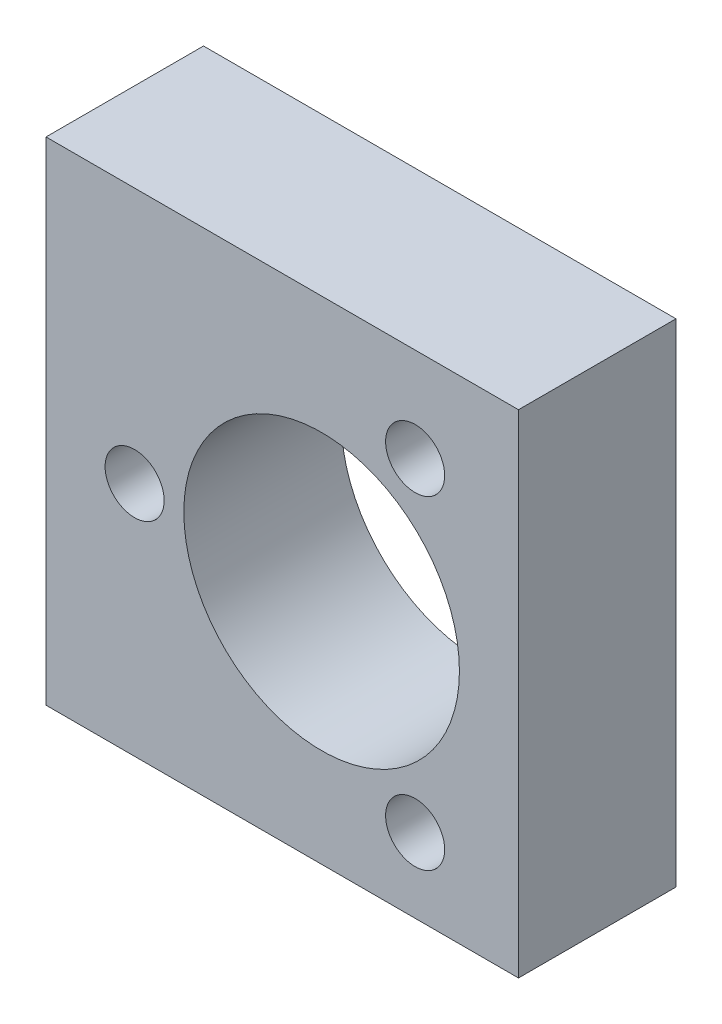
ISO-10303-21;
HEADER;
FILE_DESCRIPTION(('STEP AP214'),'2;1');
FILE_NAME('part.step','',(''),(''),'','','');
FILE_SCHEMA(('AUTOMOTIVE_DESIGN { 1 0 10303 214 1 1 1 1 }'));
ENDSEC;
DATA;
#1=APPLICATION_CONTEXT('core data for automotive mechanical design processes');
#2=APPLICATION_PROTOCOL_DEFINITION('international standard','automotive_design',2000,#1);
#3=PRODUCT_CONTEXT('',#1,'mechanical');
#4=PRODUCT('Part','Part','',(#3));
#5=PRODUCT_RELATED_PRODUCT_CATEGORY('part','',(#4));
#6=PRODUCT_DEFINITION_FORMATION('','',#4);
#7=PRODUCT_DEFINITION_CONTEXT('part definition',#1,'design');
#8=PRODUCT_DEFINITION('design','',#6,#7);
#9=PRODUCT_DEFINITION_SHAPE('','',#8);
#10=(LENGTH_UNIT() NAMED_UNIT(*) SI_UNIT(.MILLI.,.METRE.));
#11=(NAMED_UNIT(*) PLANE_ANGLE_UNIT() SI_UNIT($,.RADIAN.));
#12=(NAMED_UNIT(*) SI_UNIT($,.STERADIAN.) SOLID_ANGLE_UNIT());
#13=UNCERTAINTY_MEASURE_WITH_UNIT(LENGTH_MEASURE(1.E-05),#10,'distance_accuracy_value','');
#14=(GEOMETRIC_REPRESENTATION_CONTEXT(3) GLOBAL_UNCERTAINTY_ASSIGNED_CONTEXT((#13)) GLOBAL_UNIT_ASSIGNED_CONTEXT((#10,
#11,#12)) REPRESENTATION_CONTEXT('',''));
#15=CARTESIAN_POINT('',(0.,0.,0.));
#16=DIRECTION('',(0.,0.,1.));
#17=DIRECTION('',(1.,0.,0.));
#18=AXIS2_PLACEMENT_3D('',#15,#16,#17);
#19=CARTESIAN_POINT('',(0.,0.,8.));
#20=DIRECTION('',(0.,0.,-1.));
#21=DIRECTION('',(-1.,0.,0.));
#22=AXIS2_PLACEMENT_3D('',#19,#20,#21);
#23=PLANE('',#22);
#24=DIRECTION('',(0.,-1.,0.));
#25=VECTOR('',#24,1.);
#26=CARTESIAN_POINT('',(0.,0.,8.));
#27=LINE('',#26,#25);
#28=CARTESIAN_POINT('',(0.,25.,8.));
#29=VERTEX_POINT('',#28);
#30=CARTESIAN_POINT('',(0.,0.,8.));
#31=VERTEX_POINT('',#30);
#32=EDGE_CURVE('E84',#29,#31,#27,.T.);
#33=ORIENTED_EDGE('',*,*,#32,.T.);
#34=DIRECTION('',(1.,0.,0.));
#35=VECTOR('',#34,1.);
#36=CARTESIAN_POINT('',(0.,0.,8.));
#37=LINE('',#36,#35);
#38=CARTESIAN_POINT('',(24.,0.,8.));
#39=VERTEX_POINT('',#38);
#40=EDGE_CURVE('E79',#31,#39,#37,.T.);
#41=ORIENTED_EDGE('',*,*,#40,.T.);
#42=DIRECTION('',(0.,1.,0.));
#43=VECTOR('',#42,1.);
#44=CARTESIAN_POINT('',(24.,0.,8.));
#45=LINE('',#44,#43);
#46=CARTESIAN_POINT('',(24.,25.,8.));
#47=VERTEX_POINT('',#46);
#48=EDGE_CURVE('E82',#39,#47,#45,.T.);
#49=ORIENTED_EDGE('',*,*,#48,.T.);
#50=DIRECTION('',(-1.,0.,0.));
#51=VECTOR('',#50,1.);
#52=CARTESIAN_POINT('',(0.,25.,8.));
#53=LINE('',#52,#51);
#54=EDGE_CURVE('E49',#47,#29,#53,.T.);
#55=ORIENTED_EDGE('',*,*,#54,.T.);
#56=EDGE_LOOP('',(#33,#41,#49,#55));
#57=FACE_BOUND('',#56,.T.);
#58=CARTESIAN_POINT('',(14.,12.,8.));
#59=DIRECTION('',(0.,0.,1.));
#60=DIRECTION('',(1.,0.,0.));
#61=AXIS2_PLACEMENT_3D('',#58,#59,#60);
#62=CIRCLE('',#61,7.);
#63=CARTESIAN_POINT('',(21.,12.,8.));
#64=VERTEX_POINT('',#63);
#65=EDGE_CURVE('E99',#64,#64,#62,.T.);
#66=ORIENTED_EDGE('',*,*,#65,.F.);
#67=EDGE_LOOP('',(#66));
#68=FACE_BOUND('',#67,.T.);
#69=CARTESIAN_POINT('',(4.5,12.,8.));
#70=DIRECTION('',(0.,0.,1.));
#71=DIRECTION('',(1.,0.,0.));
#72=AXIS2_PLACEMENT_3D('',#69,#70,#71);
#73=CIRCLE('',#72,1.5);
#74=CARTESIAN_POINT('',(6.,12.,8.));
#75=VERTEX_POINT('',#74);
#76=EDGE_CURVE('E114',#75,#75,#73,.T.);
#77=ORIENTED_EDGE('',*,*,#76,.F.);
#78=EDGE_LOOP('',(#77));
#79=FACE_BOUND('',#78,.T.);
#80=CARTESIAN_POINT('',(18.75,20.2272413359521,8.));
#81=DIRECTION('',(0.,0.,1.));
#82=DIRECTION('',(1.,0.,0.));
#83=AXIS2_PLACEMENT_3D('',#80,#81,#82);
#84=CIRCLE('',#83,1.5);
#85=CARTESIAN_POINT('',(20.25,20.2272413359521,8.));
#86=VERTEX_POINT('',#85);
#87=EDGE_CURVE('E120',#86,#86,#84,.T.);
#88=ORIENTED_EDGE('',*,*,#87,.F.);
#89=EDGE_LOOP('',(#88));
#90=FACE_BOUND('',#89,.T.);
#91=CARTESIAN_POINT('',(18.7499999999999,3.77275866404779,8.));
#92=DIRECTION('',(0.,0.,1.));
#93=DIRECTION('',(1.,0.,0.));
#94=AXIS2_PLACEMENT_3D('',#91,#92,#93);
#95=CIRCLE('',#94,1.5);
#96=CARTESIAN_POINT('',(20.2499999999999,3.77275866404779,8.));
#97=VERTEX_POINT('',#96);
#98=EDGE_CURVE('E126',#97,#97,#95,.T.);
#99=ORIENTED_EDGE('',*,*,#98,.F.);
#100=EDGE_LOOP('',(#99));
#101=FACE_BOUND('',#100,.T.);
#102=ADVANCED_FACE('F32',(#57,#68,#79,#90,#101),#23,.F.);
#103=CARTESIAN_POINT('',(0.,0.,0.));
#104=DIRECTION('',(0.,0.,-1.));
#105=DIRECTION('',(-1.,0.,0.));
#106=AXIS2_PLACEMENT_3D('',#103,#104,#105);
#107=PLANE('',#106);
#108=CARTESIAN_POINT('',(18.75,20.2272413359521,0.));
#109=DIRECTION('',(0.,0.,1.));
#110=DIRECTION('',(1.,0.,0.));
#111=AXIS2_PLACEMENT_3D('',#108,#109,#110);
#112=CIRCLE('',#111,1.5);
#113=CARTESIAN_POINT('',(20.25,20.2272413359521,0.));
#114=VERTEX_POINT('',#113);
#115=EDGE_CURVE('E123',#114,#114,#112,.T.);
#116=ORIENTED_EDGE('',*,*,#115,.T.);
#117=EDGE_LOOP('',(#116));
#118=FACE_BOUND('',#117,.T.);
#119=CARTESIAN_POINT('',(14.,12.,0.));
#120=DIRECTION('',(0.,0.,1.));
#121=DIRECTION('',(1.,0.,0.));
#122=AXIS2_PLACEMENT_3D('',#119,#120,#121);
#123=CIRCLE('',#122,7.);
#124=CARTESIAN_POINT('',(21.,12.,0.));
#125=VERTEX_POINT('',#124);
#126=EDGE_CURVE('E111',#125,#125,#123,.T.);
#127=ORIENTED_EDGE('',*,*,#126,.T.);
#128=EDGE_LOOP('',(#127));
#129=FACE_BOUND('',#128,.T.);
#130=DIRECTION('',(0.,-1.,0.));
#131=VECTOR('',#130,1.);
#132=CARTESIAN_POINT('',(0.,0.,0.));
#133=LINE('',#132,#131);
#134=CARTESIAN_POINT('',(0.,25.,0.));
#135=VERTEX_POINT('',#134);
#136=CARTESIAN_POINT('',(0.,0.,0.));
#137=VERTEX_POINT('',#136);
#138=EDGE_CURVE('E96',#135,#137,#133,.T.);
#139=ORIENTED_EDGE('',*,*,#138,.F.);
#140=DIRECTION('',(-1.,0.,0.));
#141=VECTOR('',#140,1.);
#142=CARTESIAN_POINT('',(0.,25.,0.));
#143=LINE('',#142,#141);
#144=CARTESIAN_POINT('',(24.,25.,0.));
#145=VERTEX_POINT('',#144);
#146=EDGE_CURVE('E72',#145,#135,#143,.T.);
#147=ORIENTED_EDGE('',*,*,#146,.F.);
#148=DIRECTION('',(0.,1.,0.));
#149=VECTOR('',#148,1.);
#150=CARTESIAN_POINT('',(24.,0.,0.));
#151=LINE('',#150,#149);
#152=CARTESIAN_POINT('',(24.,0.,0.));
#153=VERTEX_POINT('',#152);
#154=EDGE_CURVE('E66',#153,#145,#151,.T.);
#155=ORIENTED_EDGE('',*,*,#154,.F.);
#156=DIRECTION('',(1.,0.,0.));
#157=VECTOR('',#156,1.);
#158=CARTESIAN_POINT('',(0.,0.,0.));
#159=LINE('',#158,#157);
#160=EDGE_CURVE('E88',#137,#153,#159,.T.);
#161=ORIENTED_EDGE('',*,*,#160,.F.);
#162=EDGE_LOOP('',(#139,#147,#155,#161));
#163=FACE_BOUND('',#162,.T.);
#164=CARTESIAN_POINT('',(4.5,12.,0.));
#165=DIRECTION('',(0.,0.,1.));
#166=DIRECTION('',(1.,0.,0.));
#167=AXIS2_PLACEMENT_3D('',#164,#165,#166);
#168=CIRCLE('',#167,1.5);
#169=CARTESIAN_POINT('',(6.,12.,0.));
#170=VERTEX_POINT('',#169);
#171=EDGE_CURVE('E117',#170,#170,#168,.T.);
#172=ORIENTED_EDGE('',*,*,#171,.T.);
#173=EDGE_LOOP('',(#172));
#174=FACE_BOUND('',#173,.T.);
#175=CARTESIAN_POINT('',(18.7499999999999,3.77275866404779,0.));
#176=DIRECTION('',(0.,0.,1.));
#177=DIRECTION('',(1.,0.,0.));
#178=AXIS2_PLACEMENT_3D('',#175,#176,#177);
#179=CIRCLE('',#178,1.5);
#180=CARTESIAN_POINT('',(20.2499999999999,3.77275866404779,0.));
#181=VERTEX_POINT('',#180);
#182=EDGE_CURVE('E129',#181,#181,#179,.T.);
#183=ORIENTED_EDGE('',*,*,#182,.T.);
#184=EDGE_LOOP('',(#183));
#185=FACE_BOUND('',#184,.T.);
#186=ADVANCED_FACE('F107',(#118,#129,#163,#174,#185),#107,.T.);
#187=CARTESIAN_POINT('',(0.,0.,8.));
#188=DIRECTION('',(1.,0.,0.));
#189=DIRECTION('',(0.,0.,-1.));
#190=AXIS2_PLACEMENT_3D('',#187,#188,#189);
#191=PLANE('',#190);
#192=ORIENTED_EDGE('',*,*,#138,.T.);
#193=DIRECTION('',(0.,0.,-1.));
#194=VECTOR('',#193,1.);
#195=CARTESIAN_POINT('',(0.,0.,8.));
#196=LINE('',#195,#194);
#197=EDGE_CURVE('E11',#31,#137,#196,.T.);
#198=ORIENTED_EDGE('',*,*,#197,.F.);
#199=ORIENTED_EDGE('',*,*,#32,.F.);
#200=DIRECTION('',(0.,0.,-1.));
#201=VECTOR('',#200,1.);
#202=CARTESIAN_POINT('',(0.,25.,8.));
#203=LINE('',#202,#201);
#204=EDGE_CURVE('E92',#29,#135,#203,.T.);
#205=ORIENTED_EDGE('',*,*,#204,.T.);
#206=EDGE_LOOP('',(#192,#198,#199,#205));
#207=FACE_BOUND('',#206,.T.);
#208=ADVANCED_FACE('F34',(#207),#191,.F.);
#209=CARTESIAN_POINT('',(0.,0.,8.));
#210=DIRECTION('',(0.,1.,0.));
#211=DIRECTION('',(0.,0.,1.));
#212=AXIS2_PLACEMENT_3D('',#209,#210,#211);
#213=PLANE('',#212);
#214=ORIENTED_EDGE('',*,*,#160,.T.);
#215=DIRECTION('',(0.,0.,-1.));
#216=VECTOR('',#215,1.);
#217=CARTESIAN_POINT('',(24.,0.,8.));
#218=LINE('',#217,#216);
#219=EDGE_CURVE('E41',#39,#153,#218,.T.);
#220=ORIENTED_EDGE('',*,*,#219,.F.);
#221=ORIENTED_EDGE('',*,*,#40,.F.);
#222=ORIENTED_EDGE('',*,*,#197,.T.);
#223=EDGE_LOOP('',(#214,#220,#221,#222));
#224=FACE_BOUND('',#223,.T.);
#225=ADVANCED_FACE('F87',(#224),#213,.F.);
#226=CARTESIAN_POINT('',(24.,0.,8.));
#227=DIRECTION('',(-1.,0.,0.));
#228=DIRECTION('',(0.,0.,1.));
#229=AXIS2_PLACEMENT_3D('',#226,#227,#228);
#230=PLANE('',#229);
#231=ORIENTED_EDGE('',*,*,#154,.T.);
#232=DIRECTION('',(0.,0.,-1.));
#233=VECTOR('',#232,1.);
#234=CARTESIAN_POINT('',(24.,25.,8.));
#235=LINE('',#234,#233);
#236=EDGE_CURVE('E89',#47,#145,#235,.T.);
#237=ORIENTED_EDGE('',*,*,#236,.F.);
#238=ORIENTED_EDGE('',*,*,#48,.F.);
#239=ORIENTED_EDGE('',*,*,#219,.T.);
#240=EDGE_LOOP('',(#231,#237,#238,#239));
#241=FACE_BOUND('',#240,.T.);
#242=ADVANCED_FACE('F90',(#241),#230,.F.);
#243=CARTESIAN_POINT('',(0.,25.,8.));
#244=DIRECTION('',(0.,-1.,0.));
#245=DIRECTION('',(0.,0.,-1.));
#246=AXIS2_PLACEMENT_3D('',#243,#244,#245);
#247=PLANE('',#246);
#248=ORIENTED_EDGE('',*,*,#146,.T.);
#249=ORIENTED_EDGE('',*,*,#204,.F.);
#250=ORIENTED_EDGE('',*,*,#54,.F.);
#251=ORIENTED_EDGE('',*,*,#236,.T.);
#252=EDGE_LOOP('',(#248,#249,#250,#251));
#253=FACE_BOUND('',#252,.T.);
#254=ADVANCED_FACE('F104',(#253),#247,.F.);
#255=CARTESIAN_POINT('',(14.,12.,8.));
#256=DIRECTION('',(0.,0.,-1.));
#257=DIRECTION('',(-1.,0.,0.));
#258=AXIS2_PLACEMENT_3D('',#255,#256,#257);
#259=CYLINDRICAL_SURFACE('',#258,7.);
#260=ORIENTED_EDGE('',*,*,#65,.T.);
#261=EDGE_LOOP('',(#260));
#262=FACE_BOUND('',#261,.T.);
#263=ORIENTED_EDGE('',*,*,#126,.F.);
#264=EDGE_LOOP('',(#263));
#265=FACE_BOUND('',#264,.T.);
#266=ADVANCED_FACE('F146',(#262,#265),#259,.F.);
#267=CARTESIAN_POINT('',(4.5,12.,8.));
#268=DIRECTION('',(0.,0.,-1.));
#269=DIRECTION('',(-1.,0.,0.));
#270=AXIS2_PLACEMENT_3D('',#267,#268,#269);
#271=CYLINDRICAL_SURFACE('',#270,1.5);
#272=ORIENTED_EDGE('',*,*,#76,.T.);
#273=EDGE_LOOP('',(#272));
#274=FACE_BOUND('',#273,.T.);
#275=ORIENTED_EDGE('',*,*,#171,.F.);
#276=EDGE_LOOP('',(#275));
#277=FACE_BOUND('',#276,.T.);
#278=ADVANCED_FACE('F192',(#274,#277),#271,.F.);
#279=CARTESIAN_POINT('',(18.75,20.2272413359521,8.));
#280=DIRECTION('',(0.,0.,-1.));
#281=DIRECTION('',(-1.,0.,0.));
#282=AXIS2_PLACEMENT_3D('',#279,#280,#281);
#283=CYLINDRICAL_SURFACE('',#282,1.5);
#284=ORIENTED_EDGE('',*,*,#87,.T.);
#285=EDGE_LOOP('',(#284));
#286=FACE_BOUND('',#285,.T.);
#287=ORIENTED_EDGE('',*,*,#115,.F.);
#288=EDGE_LOOP('',(#287));
#289=FACE_BOUND('',#288,.T.);
#290=ADVANCED_FACE('F200',(#286,#289),#283,.F.);
#291=CARTESIAN_POINT('',(18.7499999999999,3.77275866404779,8.));
#292=DIRECTION('',(0.,0.,-1.));
#293=DIRECTION('',(-1.,0.,0.));
#294=AXIS2_PLACEMENT_3D('',#291,#292,#293);
#295=CYLINDRICAL_SURFACE('',#294,1.5);
#296=ORIENTED_EDGE('',*,*,#98,.T.);
#297=EDGE_LOOP('',(#296));
#298=FACE_BOUND('',#297,.T.);
#299=ORIENTED_EDGE('',*,*,#182,.F.);
#300=EDGE_LOOP('',(#299));
#301=FACE_BOUND('',#300,.T.);
#302=ADVANCED_FACE('F135',(#298,#301),#295,.F.);
#303=CLOSED_SHELL('',(#102,#186,#208,#225,#242,#254,#266,#278,#290,#302));
#304=MANIFOLD_SOLID_BREP('B2',#303);
#305=ADVANCED_BREP_SHAPE_REPRESENTATION('',(#18,#304),#14);
#306=SHAPE_DEFINITION_REPRESENTATION(#9,#305);
ENDSEC;
END-ISO-10303-21;
